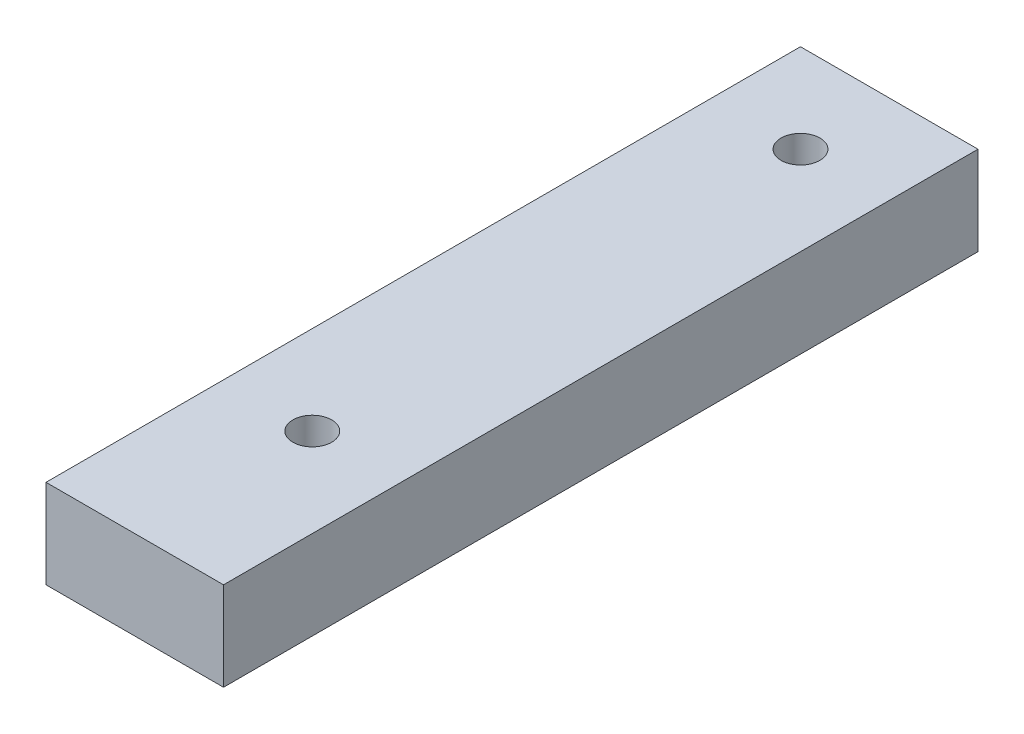
ISO-10303-21;
HEADER;
FILE_DESCRIPTION(('STEP AP214'),'2;1');
FILE_NAME('part.step','',(''),(''),'','','');
FILE_SCHEMA(('AUTOMOTIVE_DESIGN { 1 0 10303 214 1 1 1 1 }'));
ENDSEC;
DATA;
#1=APPLICATION_CONTEXT('core data for automotive mechanical design processes');
#2=APPLICATION_PROTOCOL_DEFINITION('international standard','automotive_design',2000,#1);
#3=PRODUCT_CONTEXT('',#1,'mechanical');
#4=PRODUCT('Part','Part','',(#3));
#5=PRODUCT_RELATED_PRODUCT_CATEGORY('part','',(#4));
#6=PRODUCT_DEFINITION_FORMATION('','',#4);
#7=PRODUCT_DEFINITION_CONTEXT('part definition',#1,'design');
#8=PRODUCT_DEFINITION('design','',#6,#7);
#9=PRODUCT_DEFINITION_SHAPE('','',#8);
#10=(LENGTH_UNIT() NAMED_UNIT(*) SI_UNIT(.MILLI.,.METRE.));
#11=(NAMED_UNIT(*) PLANE_ANGLE_UNIT() SI_UNIT($,.RADIAN.));
#12=(NAMED_UNIT(*) SI_UNIT($,.STERADIAN.) SOLID_ANGLE_UNIT());
#13=UNCERTAINTY_MEASURE_WITH_UNIT(LENGTH_MEASURE(1.E-05),#10,'distance_accuracy_value','');
#14=(GEOMETRIC_REPRESENTATION_CONTEXT(3) GLOBAL_UNCERTAINTY_ASSIGNED_CONTEXT((#13)) GLOBAL_UNIT_ASSIGNED_CONTEXT((#10,
#11,#12)) REPRESENTATION_CONTEXT('',''));
#15=CARTESIAN_POINT('',(0.,0.,0.));
#16=DIRECTION('',(0.,0.,1.));
#17=DIRECTION('',(1.,0.,0.));
#18=AXIS2_PLACEMENT_3D('',#15,#16,#17);
#19=CARTESIAN_POINT('',(0.,6.34999999999999,0.));
#20=DIRECTION('',(1.,0.,0.));
#21=DIRECTION('',(0.,0.,-1.));
#22=AXIS2_PLACEMENT_3D('',#19,#20,#21);
#23=PLANE('',#22);
#24=DIRECTION('',(0.,0.,1.));
#25=VECTOR('',#24,1.);
#26=CARTESIAN_POINT('',(0.,0.,0.));
#27=LINE('',#26,#25);
#28=CARTESIAN_POINT('',(0.,0.,-304.8));
#29=VERTEX_POINT('',#28);
#30=CARTESIAN_POINT('',(-2.22044604925031E-13,0.,-250.825));
#31=VERTEX_POINT('',#30);
#32=EDGE_CURVE('E115',#29,#31,#27,.T.);
#33=ORIENTED_EDGE('',*,*,#32,.T.);
#34=DIRECTION('',(0.,1.,0.));
#35=VECTOR('',#34,1.);
#36=CARTESIAN_POINT('',(-2.22044604925031E-13,0.,-250.825));
#37=LINE('',#36,#35);
#38=CARTESIAN_POINT('',(-2.22044604925031E-13,6.34999999999999,-250.825));
#39=VERTEX_POINT('',#38);
#40=EDGE_CURVE('E60',#31,#39,#37,.T.);
#41=ORIENTED_EDGE('',*,*,#40,.T.);
#42=DIRECTION('',(0.,0.,1.));
#43=VECTOR('',#42,1.);
#44=CARTESIAN_POINT('',(0.,6.34999999999999,0.));
#45=LINE('',#44,#43);
#46=CARTESIAN_POINT('',(0.,6.34999999999999,-304.8));
#47=VERTEX_POINT('',#46);
#48=EDGE_CURVE('E117',#47,#39,#45,.T.);
#49=ORIENTED_EDGE('',*,*,#48,.F.);
#50=DIRECTION('',(0.,-1.,0.));
#51=VECTOR('',#50,1.);
#52=CARTESIAN_POINT('',(0.,6.34999999999999,-304.8));
#53=LINE('',#52,#51);
#54=EDGE_CURVE('E13',#47,#29,#53,.T.);
#55=ORIENTED_EDGE('',*,*,#54,.T.);
#56=EDGE_LOOP('',(#33,#41,#49,#55));
#57=FACE_BOUND('',#56,.T.);
#58=ADVANCED_FACE('F46',(#57),#23,.F.);
#59=CARTESIAN_POINT('',(0.,6.34999999999999,-304.8));
#60=DIRECTION('',(0.,0.,1.));
#61=DIRECTION('',(1.,0.,0.));
#62=AXIS2_PLACEMENT_3D('',#59,#60,#61);
#63=PLANE('',#62);
#64=DIRECTION('',(-1.,0.,0.));
#65=VECTOR('',#64,1.);
#66=CARTESIAN_POINT('',(0.,6.34999999999999,-304.8));
#67=LINE('',#66,#65);
#68=CARTESIAN_POINT('',(12.7,6.34999999999999,-304.8));
#69=VERTEX_POINT('',#68);
#70=EDGE_CURVE('E53',#69,#47,#67,.T.);
#71=ORIENTED_EDGE('',*,*,#70,.F.);
#72=DIRECTION('',(0.,1.,0.));
#73=VECTOR('',#72,1.);
#74=CARTESIAN_POINT('',(12.7,0.,-304.8));
#75=LINE('',#74,#73);
#76=CARTESIAN_POINT('',(12.7,0.,-304.8));
#77=VERTEX_POINT('',#76);
#78=EDGE_CURVE('E113',#77,#69,#75,.T.);
#79=ORIENTED_EDGE('',*,*,#78,.F.);
#80=DIRECTION('',(-1.,0.,0.));
#81=VECTOR('',#80,1.);
#82=CARTESIAN_POINT('',(0.,0.,-304.8));
#83=LINE('',#82,#81);
#84=EDGE_CURVE('E103',#77,#29,#83,.T.);
#85=ORIENTED_EDGE('',*,*,#84,.T.);
#86=ORIENTED_EDGE('',*,*,#54,.F.);
#87=EDGE_LOOP('',(#71,#79,#85,#86));
#88=FACE_BOUND('',#87,.T.);
#89=ADVANCED_FACE('F121',(#88),#63,.F.);
#90=CARTESIAN_POINT('',(0.,6.34999999999999,0.));
#91=DIRECTION('',(0.,-1.,0.));
#92=DIRECTION('',(0.,0.,-1.));
#93=AXIS2_PLACEMENT_3D('',#90,#91,#92);
#94=PLANE('',#93);
#95=CARTESIAN_POINT('',(6.34999999999999,6.34999999999999,-263.525));
#96=DIRECTION('',(0.,1.,0.));
#97=DIRECTION('',(0.,0.,1.));
#98=AXIS2_PLACEMENT_3D('',#95,#96,#97);
#99=CIRCLE('',#98,1.38906249999999);
#100=CARTESIAN_POINT('',(6.34999999999999,6.34999999999999,-262.1359375));
#101=VERTEX_POINT('',#100);
#102=EDGE_CURVE('E183',#101,#101,#99,.T.);
#103=ORIENTED_EDGE('',*,*,#102,.F.);
#104=EDGE_LOOP('',(#103));
#105=FACE_BOUND('',#104,.T.);
#106=CARTESIAN_POINT('',(6.3499999999998,6.34999999999999,-298.45));
#107=DIRECTION('',(0.,1.,0.));
#108=DIRECTION('',(0.,0.,1.));
#109=AXIS2_PLACEMENT_3D('',#106,#107,#108);
#110=CIRCLE('',#109,1.38906249999999);
#111=CARTESIAN_POINT('',(6.3499999999998,6.34999999999999,-297.0609375));
#112=VERTEX_POINT('',#111);
#113=EDGE_CURVE('E108',#112,#112,#110,.T.);
#114=ORIENTED_EDGE('',*,*,#113,.F.);
#115=EDGE_LOOP('',(#114));
#116=FACE_BOUND('',#115,.T.);
#117=DIRECTION('',(-1.,0.,0.));
#118=VECTOR('',#117,1.);
#119=CARTESIAN_POINT('',(12.6999999999998,6.34999999999999,-250.825));
#120=LINE('',#119,#118);
#121=CARTESIAN_POINT('',(12.6999999999998,6.34999999999999,-250.825));
#122=VERTEX_POINT('',#121);
#123=EDGE_CURVE('E104',#122,#39,#120,.T.);
#124=ORIENTED_EDGE('',*,*,#123,.F.);
#125=DIRECTION('',(0.,0.,1.));
#126=VECTOR('',#125,1.);
#127=CARTESIAN_POINT('',(12.7,6.34999999999999,-304.8));
#128=LINE('',#127,#126);
#129=EDGE_CURVE('E92',#69,#122,#128,.T.);
#130=ORIENTED_EDGE('',*,*,#129,.F.);
#131=ORIENTED_EDGE('',*,*,#70,.T.);
#132=ORIENTED_EDGE('',*,*,#48,.T.);
#133=EDGE_LOOP('',(#124,#130,#131,#132));
#134=FACE_BOUND('',#133,.T.);
#135=ADVANCED_FACE('F124',(#105,#116,#134),#94,.F.);
#136=CARTESIAN_POINT('',(0.,0.,0.));
#137=DIRECTION('',(0.,-1.,0.));
#138=DIRECTION('',(0.,0.,-1.));
#139=AXIS2_PLACEMENT_3D('',#136,#137,#138);
#140=PLANE('',#139);
#141=CARTESIAN_POINT('',(6.34999999999999,0.,-263.525));
#142=DIRECTION('',(0.,1.,0.));
#143=DIRECTION('',(0.,0.,1.));
#144=AXIS2_PLACEMENT_3D('',#141,#142,#143);
#145=CIRCLE('',#144,1.38906249999999);
#146=CARTESIAN_POINT('',(6.34999999999999,0.,-262.1359375));
#147=VERTEX_POINT('',#146);
#148=EDGE_CURVE('E111',#147,#147,#145,.T.);
#149=ORIENTED_EDGE('',*,*,#148,.T.);
#150=EDGE_LOOP('',(#149));
#151=FACE_BOUND('',#150,.T.);
#152=CARTESIAN_POINT('',(6.3499999999998,0.,-298.45));
#153=DIRECTION('',(0.,1.,0.));
#154=DIRECTION('',(0.,0.,1.));
#155=AXIS2_PLACEMENT_3D('',#152,#153,#154);
#156=CIRCLE('',#155,1.38906249999999);
#157=CARTESIAN_POINT('',(6.3499999999998,0.,-297.0609375));
#158=VERTEX_POINT('',#157);
#159=EDGE_CURVE('E184',#158,#158,#156,.T.);
#160=ORIENTED_EDGE('',*,*,#159,.T.);
#161=EDGE_LOOP('',(#160));
#162=FACE_BOUND('',#161,.T.);
#163=DIRECTION('',(0.,0.,1.));
#164=VECTOR('',#163,1.);
#165=CARTESIAN_POINT('',(12.7,0.,-304.8));
#166=LINE('',#165,#164);
#167=CARTESIAN_POINT('',(12.6999999999998,0.,-250.825));
#168=VERTEX_POINT('',#167);
#169=EDGE_CURVE('E90',#77,#168,#166,.T.);
#170=ORIENTED_EDGE('',*,*,#169,.T.);
#171=DIRECTION('',(-1.,0.,0.));
#172=VECTOR('',#171,1.);
#173=CARTESIAN_POINT('',(12.6999999999998,0.,-250.825));
#174=LINE('',#173,#172);
#175=EDGE_CURVE('E94',#168,#31,#174,.T.);
#176=ORIENTED_EDGE('',*,*,#175,.T.);
#177=ORIENTED_EDGE('',*,*,#32,.F.);
#178=ORIENTED_EDGE('',*,*,#84,.F.);
#179=EDGE_LOOP('',(#170,#176,#177,#178));
#180=FACE_BOUND('',#179,.T.);
#181=ADVANCED_FACE('F102',(#151,#162,#180),#140,.T.);
#182=CARTESIAN_POINT('',(12.7,0.,-304.8));
#183=DIRECTION('',(-1.,0.,0.));
#184=DIRECTION('',(0.,0.,1.));
#185=AXIS2_PLACEMENT_3D('',#182,#183,#184);
#186=PLANE('',#185);
#187=ORIENTED_EDGE('',*,*,#129,.T.);
#188=DIRECTION('',(0.,1.,0.));
#189=VECTOR('',#188,1.);
#190=CARTESIAN_POINT('',(12.6999999999998,0.,-250.825));
#191=LINE('',#190,#189);
#192=EDGE_CURVE('E87',#168,#122,#191,.T.);
#193=ORIENTED_EDGE('',*,*,#192,.F.);
#194=ORIENTED_EDGE('',*,*,#169,.F.);
#195=ORIENTED_EDGE('',*,*,#78,.T.);
#196=EDGE_LOOP('',(#187,#193,#194,#195));
#197=FACE_BOUND('',#196,.T.);
#198=ADVANCED_FACE('F88',(#197),#186,.F.);
#199=CARTESIAN_POINT('',(12.6999999999998,0.,-250.825));
#200=DIRECTION('',(0.,0.,-1.));
#201=DIRECTION('',(-1.,0.,0.));
#202=AXIS2_PLACEMENT_3D('',#199,#200,#201);
#203=PLANE('',#202);
#204=ORIENTED_EDGE('',*,*,#123,.T.);
#205=ORIENTED_EDGE('',*,*,#40,.F.);
#206=ORIENTED_EDGE('',*,*,#175,.F.);
#207=ORIENTED_EDGE('',*,*,#192,.T.);
#208=EDGE_LOOP('',(#204,#205,#206,#207));
#209=FACE_BOUND('',#208,.T.);
#210=ADVANCED_FACE('F96',(#209),#203,.F.);
#211=CARTESIAN_POINT('',(6.3499999999998,0.,-298.45));
#212=DIRECTION('',(0.,1.,0.));
#213=DIRECTION('',(0.,0.,1.));
#214=AXIS2_PLACEMENT_3D('',#211,#212,#213);
#215=CYLINDRICAL_SURFACE('',#214,1.38906249999999);
#216=ORIENTED_EDGE('',*,*,#159,.F.);
#217=EDGE_LOOP('',(#216));
#218=FACE_BOUND('',#217,.T.);
#219=ORIENTED_EDGE('',*,*,#113,.T.);
#220=EDGE_LOOP('',(#219));
#221=FACE_BOUND('',#220,.T.);
#222=ADVANCED_FACE('F162',(#218,#221),#215,.F.);
#223=CARTESIAN_POINT('',(6.34999999999999,0.,-263.525));
#224=DIRECTION('',(0.,1.,0.));
#225=DIRECTION('',(0.,0.,1.));
#226=AXIS2_PLACEMENT_3D('',#223,#224,#225);
#227=CYLINDRICAL_SURFACE('',#226,1.38906249999999);
#228=ORIENTED_EDGE('',*,*,#148,.F.);
#229=EDGE_LOOP('',(#228));
#230=FACE_BOUND('',#229,.T.);
#231=ORIENTED_EDGE('',*,*,#102,.T.);
#232=EDGE_LOOP('',(#231));
#233=FACE_BOUND('',#232,.T.);
#234=ADVANCED_FACE('F169',(#230,#233),#227,.F.);
#235=CLOSED_SHELL('',(#58,#89,#135,#181,#198,#210,#222,#234));
#236=MANIFOLD_SOLID_BREP('B2',#235);
#237=ADVANCED_BREP_SHAPE_REPRESENTATION('',(#18,#236),#14);
#238=SHAPE_DEFINITION_REPRESENTATION(#9,#237);
ENDSEC;
END-ISO-10303-21;
